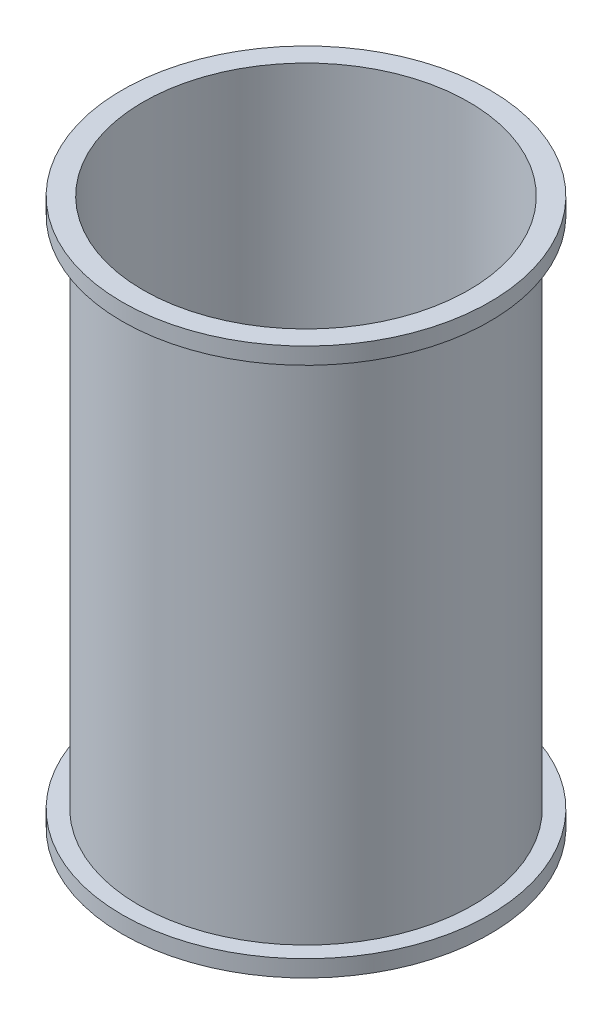
ISO-10303-21;
HEADER;
FILE_DESCRIPTION(('STEP AP214'),'2;1');
FILE_NAME('part.step','',(''),(''),'','','');
FILE_SCHEMA(('AUTOMOTIVE_DESIGN { 1 0 10303 214 1 1 1 1 }'));
ENDSEC;
DATA;
#1=APPLICATION_CONTEXT('core data for automotive mechanical design processes');
#2=APPLICATION_PROTOCOL_DEFINITION('international standard','automotive_design',2000,#1);
#3=PRODUCT_CONTEXT('',#1,'mechanical');
#4=PRODUCT('Part','Part','',(#3));
#5=PRODUCT_RELATED_PRODUCT_CATEGORY('part','',(#4));
#6=PRODUCT_DEFINITION_FORMATION('','',#4);
#7=PRODUCT_DEFINITION_CONTEXT('part definition',#1,'design');
#8=PRODUCT_DEFINITION('design','',#6,#7);
#9=PRODUCT_DEFINITION_SHAPE('','',#8);
#10=(LENGTH_UNIT() NAMED_UNIT(*) SI_UNIT(.MILLI.,.METRE.));
#11=(NAMED_UNIT(*) PLANE_ANGLE_UNIT() SI_UNIT($,.RADIAN.));
#12=(NAMED_UNIT(*) SI_UNIT($,.STERADIAN.) SOLID_ANGLE_UNIT());
#13=UNCERTAINTY_MEASURE_WITH_UNIT(LENGTH_MEASURE(1.E-05),#10,'distance_accuracy_value','');
#14=(GEOMETRIC_REPRESENTATION_CONTEXT(3) GLOBAL_UNCERTAINTY_ASSIGNED_CONTEXT((#13)) GLOBAL_UNIT_ASSIGNED_CONTEXT((#10,
#11,#12)) REPRESENTATION_CONTEXT('',''));
#15=CARTESIAN_POINT('',(0.,0.,0.));
#16=DIRECTION('',(0.,0.,1.));
#17=DIRECTION('',(1.,0.,0.));
#18=AXIS2_PLACEMENT_3D('',#15,#16,#17);
#19=CARTESIAN_POINT('',(0.,416.052,0.));
#20=DIRECTION('',(0.,-1.,0.));
#21=DIRECTION('',(0.,0.,-1.));
#22=AXIS2_PLACEMENT_3D('',#19,#20,#21);
#23=CYLINDRICAL_SURFACE('',#22,127.);
#24=CARTESIAN_POINT('',(0.,12.7,0.));
#25=DIRECTION('',(0.,1.,0.));
#26=DIRECTION('',(0.,0.,1.));
#27=AXIS2_PLACEMENT_3D('',#24,#25,#26);
#28=CIRCLE('',#27,127.);
#29=CARTESIAN_POINT('',(0.,12.7,127.));
#30=VERTEX_POINT('',#29);
#31=EDGE_CURVE('E54',#30,#30,#28,.T.);
#32=ORIENTED_EDGE('',*,*,#31,.T.);
#33=EDGE_LOOP('',(#32));
#34=FACE_BOUND('',#33,.T.);
#35=CARTESIAN_POINT('',(0.,403.352,0.));
#36=DIRECTION('',(0.,1.,0.));
#37=DIRECTION('',(0.,0.,1.));
#38=AXIS2_PLACEMENT_3D('',#35,#36,#37);
#39=CIRCLE('',#38,127.);
#40=CARTESIAN_POINT('',(0.,403.352,127.));
#41=VERTEX_POINT('',#40);
#42=EDGE_CURVE('E10',#41,#41,#39,.T.);
#43=ORIENTED_EDGE('',*,*,#42,.F.);
#44=EDGE_LOOP('',(#43));
#45=FACE_BOUND('',#44,.T.);
#46=ADVANCED_FACE('F33',(#34,#45),#23,.T.);
#47=CARTESIAN_POINT('',(0.,416.052,0.));
#48=DIRECTION('',(0.,-1.,0.));
#49=DIRECTION('',(0.,0.,-1.));
#50=AXIS2_PLACEMENT_3D('',#47,#48,#49);
#51=CYLINDRICAL_SURFACE('',#50,123.825);
#52=CARTESIAN_POINT('',(0.,416.052,0.));
#53=DIRECTION('',(0.,1.,0.));
#54=DIRECTION('',(0.,0.,1.));
#55=AXIS2_PLACEMENT_3D('',#52,#53,#54);
#56=CIRCLE('',#55,123.825);
#57=CARTESIAN_POINT('',(0.,416.052,123.825));
#58=VERTEX_POINT('',#57);
#59=EDGE_CURVE('E40',#58,#58,#56,.T.);
#60=ORIENTED_EDGE('',*,*,#59,.T.);
#61=EDGE_LOOP('',(#60));
#62=FACE_BOUND('',#61,.T.);
#63=CARTESIAN_POINT('',(0.,0.,0.));
#64=DIRECTION('',(0.,1.,0.));
#65=DIRECTION('',(0.,0.,1.));
#66=AXIS2_PLACEMENT_3D('',#63,#64,#65);
#67=CIRCLE('',#66,123.825);
#68=CARTESIAN_POINT('',(0.,0.,123.825));
#69=VERTEX_POINT('',#68);
#70=EDGE_CURVE('E44',#69,#69,#67,.T.);
#71=ORIENTED_EDGE('',*,*,#70,.F.);
#72=EDGE_LOOP('',(#71));
#73=FACE_BOUND('',#72,.T.);
#74=ADVANCED_FACE('F35',(#62,#73),#51,.F.);
#75=CARTESIAN_POINT('',(0.,416.052,0.));
#76=DIRECTION('',(0.,1.,0.));
#77=DIRECTION('',(0.,0.,1.));
#78=AXIS2_PLACEMENT_3D('',#75,#76,#77);
#79=PLANE('',#78);
#80=ORIENTED_EDGE('',*,*,#59,.F.);
#81=EDGE_LOOP('',(#80));
#82=FACE_BOUND('',#81,.T.);
#83=CARTESIAN_POINT('',(0.,416.052,0.));
#84=DIRECTION('',(0.,1.,0.));
#85=DIRECTION('',(0.,0.,1.));
#86=AXIS2_PLACEMENT_3D('',#83,#84,#85);
#87=CIRCLE('',#86,139.7);
#88=CARTESIAN_POINT('',(0.,416.052,139.7));
#89=VERTEX_POINT('',#88);
#90=EDGE_CURVE('E55',#89,#89,#87,.T.);
#91=ORIENTED_EDGE('',*,*,#90,.T.);
#92=EDGE_LOOP('',(#91));
#93=FACE_BOUND('',#92,.T.);
#94=ADVANCED_FACE('F66',(#82,#93),#79,.T.);
#95=CARTESIAN_POINT('',(0.,0.,0.));
#96=DIRECTION('',(0.,1.,0.));
#97=DIRECTION('',(0.,0.,1.));
#98=AXIS2_PLACEMENT_3D('',#95,#96,#97);
#99=PLANE('',#98);
#100=ORIENTED_EDGE('',*,*,#70,.T.);
#101=EDGE_LOOP('',(#100));
#102=FACE_BOUND('',#101,.T.);
#103=CARTESIAN_POINT('',(0.,0.,0.));
#104=DIRECTION('',(0.,1.,0.));
#105=DIRECTION('',(0.,0.,1.));
#106=AXIS2_PLACEMENT_3D('',#103,#104,#105);
#107=CIRCLE('',#106,139.7);
#108=CARTESIAN_POINT('',(0.,0.,139.7));
#109=VERTEX_POINT('',#108);
#110=EDGE_CURVE('E51',#109,#109,#107,.T.);
#111=ORIENTED_EDGE('',*,*,#110,.F.);
#112=EDGE_LOOP('',(#111));
#113=FACE_BOUND('',#112,.T.);
#114=ADVANCED_FACE('F87',(#102,#113),#99,.F.);
#115=CARTESIAN_POINT('',(0.,12.7,0.));
#116=DIRECTION('',(0.,-1.,0.));
#117=DIRECTION('',(0.,0.,-1.));
#118=AXIS2_PLACEMENT_3D('',#115,#116,#117);
#119=CYLINDRICAL_SURFACE('',#118,139.7);
#120=CARTESIAN_POINT('',(0.,12.7,0.));
#121=DIRECTION('',(0.,1.,0.));
#122=DIRECTION('',(0.,0.,1.));
#123=AXIS2_PLACEMENT_3D('',#120,#121,#122);
#124=CIRCLE('',#123,139.7);
#125=CARTESIAN_POINT('',(0.,12.7,139.7));
#126=VERTEX_POINT('',#125);
#127=EDGE_CURVE('E49',#126,#126,#124,.T.);
#128=ORIENTED_EDGE('',*,*,#127,.F.);
#129=EDGE_LOOP('',(#128));
#130=FACE_BOUND('',#129,.T.);
#131=ORIENTED_EDGE('',*,*,#110,.T.);
#132=EDGE_LOOP('',(#131));
#133=FACE_BOUND('',#132,.T.);
#134=ADVANCED_FACE('F90',(#130,#133),#119,.T.);
#135=CARTESIAN_POINT('',(0.,12.7,0.));
#136=DIRECTION('',(0.,1.,0.));
#137=DIRECTION('',(0.,0.,1.));
#138=AXIS2_PLACEMENT_3D('',#135,#136,#137);
#139=PLANE('',#138);
#140=ORIENTED_EDGE('',*,*,#31,.F.);
#141=EDGE_LOOP('',(#140));
#142=FACE_BOUND('',#141,.T.);
#143=ORIENTED_EDGE('',*,*,#127,.T.);
#144=EDGE_LOOP('',(#143));
#145=FACE_BOUND('',#144,.T.);
#146=ADVANCED_FACE('F72',(#142,#145),#139,.T.);
#147=CARTESIAN_POINT('',(0.,416.052,0.));
#148=DIRECTION('',(0.,-1.,0.));
#149=DIRECTION('',(0.,0.,-1.));
#150=AXIS2_PLACEMENT_3D('',#147,#148,#149);
#151=CYLINDRICAL_SURFACE('',#150,139.7);
#152=ORIENTED_EDGE('',*,*,#90,.F.);
#153=EDGE_LOOP('',(#152));
#154=FACE_BOUND('',#153,.T.);
#155=CARTESIAN_POINT('',(0.,403.352,0.));
#156=DIRECTION('',(0.,1.,0.));
#157=DIRECTION('',(0.,0.,1.));
#158=AXIS2_PLACEMENT_3D('',#155,#156,#157);
#159=CIRCLE('',#158,139.7);
#160=CARTESIAN_POINT('',(0.,403.352,139.7));
#161=VERTEX_POINT('',#160);
#162=EDGE_CURVE('E60',#161,#161,#159,.T.);
#163=ORIENTED_EDGE('',*,*,#162,.T.);
#164=EDGE_LOOP('',(#163));
#165=FACE_BOUND('',#164,.T.);
#166=ADVANCED_FACE('F68',(#154,#165),#151,.T.);
#167=CARTESIAN_POINT('',(0.,403.352,0.));
#168=DIRECTION('',(0.,1.,0.));
#169=DIRECTION('',(0.,0.,1.));
#170=AXIS2_PLACEMENT_3D('',#167,#168,#169);
#171=PLANE('',#170);
#172=ORIENTED_EDGE('',*,*,#42,.T.);
#173=EDGE_LOOP('',(#172));
#174=FACE_BOUND('',#173,.T.);
#175=ORIENTED_EDGE('',*,*,#162,.F.);
#176=EDGE_LOOP('',(#175));
#177=FACE_BOUND('',#176,.T.);
#178=ADVANCED_FACE('F71',(#174,#177),#171,.F.);
#179=CLOSED_SHELL('',(#46,#74,#94,#114,#134,#146,#166,#178));
#180=MANIFOLD_SOLID_BREP('B2',#179);
#181=ADVANCED_BREP_SHAPE_REPRESENTATION('',(#18,#180),#14);
#182=SHAPE_DEFINITION_REPRESENTATION(#9,#181);
ENDSEC;
END-ISO-10303-21;
